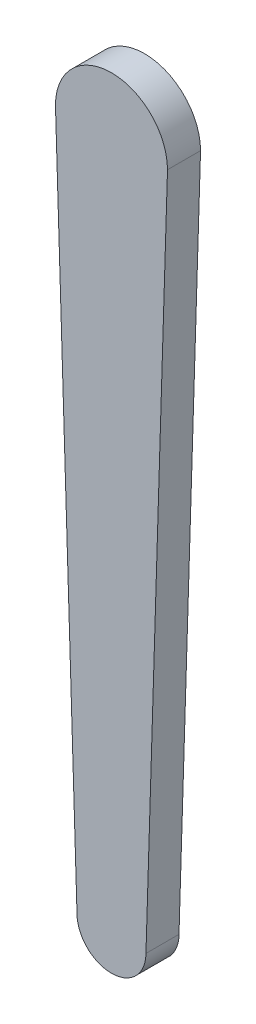
ISO-10303-21;
HEADER;
FILE_DESCRIPTION(('STEP AP214'),'2;1');
FILE_NAME('part.step','',(''),(''),'','','');
FILE_SCHEMA(('AUTOMOTIVE_DESIGN { 1 0 10303 214 1 1 1 1 }'));
ENDSEC;
DATA;
#1=APPLICATION_CONTEXT('core data for automotive mechanical design processes');
#2=APPLICATION_PROTOCOL_DEFINITION('international standard','automotive_design',2000,#1);
#3=PRODUCT_CONTEXT('',#1,'mechanical');
#4=PRODUCT('Part','Part','',(#3));
#5=PRODUCT_RELATED_PRODUCT_CATEGORY('part','',(#4));
#6=PRODUCT_DEFINITION_FORMATION('','',#4);
#7=PRODUCT_DEFINITION_CONTEXT('part definition',#1,'design');
#8=PRODUCT_DEFINITION('design','',#6,#7);
#9=PRODUCT_DEFINITION_SHAPE('','',#8);
#10=(LENGTH_UNIT() NAMED_UNIT(*) SI_UNIT(.MILLI.,.METRE.));
#11=(NAMED_UNIT(*) PLANE_ANGLE_UNIT() SI_UNIT($,.RADIAN.));
#12=(NAMED_UNIT(*) SI_UNIT($,.STERADIAN.) SOLID_ANGLE_UNIT());
#13=UNCERTAINTY_MEASURE_WITH_UNIT(LENGTH_MEASURE(1.E-05),#10,'distance_accuracy_value','');
#14=(GEOMETRIC_REPRESENTATION_CONTEXT(3) GLOBAL_UNCERTAINTY_ASSIGNED_CONTEXT((#13)) GLOBAL_UNIT_ASSIGNED_CONTEXT((#10,
#11,#12)) REPRESENTATION_CONTEXT('',''));
#15=CARTESIAN_POINT('',(0.,0.,0.));
#16=DIRECTION('',(0.,0.,1.));
#17=DIRECTION('',(1.,0.,0.));
#18=AXIS2_PLACEMENT_3D('',#15,#16,#17);
#19=CARTESIAN_POINT('',(15.7346341463415,-0.491707317073171,11.5));
#20=DIRECTION('',(0.999512076087079,-0.0312347523777212,0.));
#21=DIRECTION('',(0.0312347523777212,0.999512076087079,0.));
#22=AXIS2_PLACEMENT_3D('',#19,#20,#21);
#23=PLANE('',#22);
#24=DIRECTION('',(-0.0312347523777212,-0.999512076087079,0.));
#25=VECTOR('',#24,1.);
#26=CARTESIAN_POINT('',(15.7346341463415,-0.491707317073171,0.));
#27=LINE('',#26,#25);
#28=CARTESIAN_POINT('',(19.5,120.,0.));
#29=VERTEX_POINT('',#28);
#30=CARTESIAN_POINT('',(12.,-120.,0.));
#31=VERTEX_POINT('',#30);
#32=EDGE_CURVE('E101',#29,#31,#27,.T.);
#33=ORIENTED_EDGE('',*,*,#32,.F.);
#34=DIRECTION('',(0.,0.,-1.));
#35=VECTOR('',#34,1.);
#36=CARTESIAN_POINT('',(19.5,120.,11.5));
#37=LINE('',#36,#35);
#38=CARTESIAN_POINT('',(19.5,120.,11.5));
#39=VERTEX_POINT('',#38);
#40=EDGE_CURVE('E11',#39,#29,#37,.T.);
#41=ORIENTED_EDGE('',*,*,#40,.F.);
#42=DIRECTION('',(-0.0312347523777212,-0.999512076087079,0.));
#43=VECTOR('',#42,1.);
#44=CARTESIAN_POINT('',(15.7346341463415,-0.491707317073171,11.5));
#45=LINE('',#44,#43);
#46=CARTESIAN_POINT('',(12.,-120.,11.5));
#47=VERTEX_POINT('',#46);
#48=EDGE_CURVE('E89',#39,#47,#45,.T.);
#49=ORIENTED_EDGE('',*,*,#48,.T.);
#50=DIRECTION('',(0.,0.,-1.));
#51=VECTOR('',#50,1.);
#52=CARTESIAN_POINT('',(12.,-120.,11.5));
#53=LINE('',#52,#51);
#54=EDGE_CURVE('E78',#47,#31,#53,.T.);
#55=ORIENTED_EDGE('',*,*,#54,.T.);
#56=EDGE_LOOP('',(#33,#41,#49,#55));
#57=FACE_BOUND('',#56,.T.);
#58=ADVANCED_FACE('F39',(#57),#23,.T.);
#59=CARTESIAN_POINT('',(0.,120.,11.5));
#60=DIRECTION('',(0.,0.,-1.));
#61=DIRECTION('',(-1.,0.,0.));
#62=AXIS2_PLACEMENT_3D('',#59,#60,#61);
#63=CYLINDRICAL_SURFACE('',#62,19.5);
#64=CARTESIAN_POINT('',(0.,120.,0.));
#65=DIRECTION('',(0.,0.,1.));
#66=DIRECTION('',(1.,0.,0.));
#67=AXIS2_PLACEMENT_3D('',#64,#65,#66);
#68=CIRCLE('',#67,19.5);
#69=CARTESIAN_POINT('',(-19.5,120.,0.));
#70=VERTEX_POINT('',#69);
#71=EDGE_CURVE('E94',#29,#70,#68,.T.);
#72=ORIENTED_EDGE('',*,*,#71,.T.);
#73=DIRECTION('',(0.,0.,-1.));
#74=VECTOR('',#73,1.);
#75=CARTESIAN_POINT('',(-19.5,120.,11.5));
#76=LINE('',#75,#74);
#77=CARTESIAN_POINT('',(-19.5,120.,11.5));
#78=VERTEX_POINT('',#77);
#79=EDGE_CURVE('E47',#78,#70,#76,.T.);
#80=ORIENTED_EDGE('',*,*,#79,.F.);
#81=CARTESIAN_POINT('',(0.,120.,11.5));
#82=DIRECTION('',(0.,0.,1.));
#83=DIRECTION('',(1.,0.,0.));
#84=AXIS2_PLACEMENT_3D('',#81,#82,#83);
#85=CIRCLE('',#84,19.5);
#86=EDGE_CURVE('E84',#39,#78,#85,.T.);
#87=ORIENTED_EDGE('',*,*,#86,.F.);
#88=ORIENTED_EDGE('',*,*,#40,.T.);
#89=EDGE_LOOP('',(#72,#80,#87,#88));
#90=FACE_BOUND('',#89,.T.);
#91=ADVANCED_FACE('F92',(#90),#63,.T.);
#92=CARTESIAN_POINT('',(-15.7346341463415,-0.491707317073171,11.5));
#93=DIRECTION('',(0.999512076087079,0.0312347523777212,0.));
#94=DIRECTION('',(-0.0312347523777212,0.999512076087079,0.));
#95=AXIS2_PLACEMENT_3D('',#92,#93,#94);
#96=PLANE('',#95);
#97=DIRECTION('',(0.0312347523777212,-0.999512076087079,0.));
#98=VECTOR('',#97,1.);
#99=CARTESIAN_POINT('',(-15.7346341463415,-0.491707317073171,0.));
#100=LINE('',#99,#98);
#101=CARTESIAN_POINT('',(-12.,-120.,0.));
#102=VERTEX_POINT('',#101);
#103=EDGE_CURVE('E71',#70,#102,#100,.T.);
#104=ORIENTED_EDGE('',*,*,#103,.T.);
#105=DIRECTION('',(0.,0.,-1.));
#106=VECTOR('',#105,1.);
#107=CARTESIAN_POINT('',(-12.,-120.,11.5));
#108=LINE('',#107,#106);
#109=CARTESIAN_POINT('',(-12.,-120.,11.5));
#110=VERTEX_POINT('',#109);
#111=EDGE_CURVE('E95',#110,#102,#108,.T.);
#112=ORIENTED_EDGE('',*,*,#111,.F.);
#113=DIRECTION('',(0.0312347523777212,-0.999512076087079,0.));
#114=VECTOR('',#113,1.);
#115=CARTESIAN_POINT('',(-15.7346341463415,-0.491707317073171,11.5));
#116=LINE('',#115,#114);
#117=EDGE_CURVE('E88',#78,#110,#116,.T.);
#118=ORIENTED_EDGE('',*,*,#117,.F.);
#119=ORIENTED_EDGE('',*,*,#79,.T.);
#120=EDGE_LOOP('',(#104,#112,#118,#119));
#121=FACE_BOUND('',#120,.T.);
#122=ADVANCED_FACE('F96',(#121),#96,.F.);
#123=CARTESIAN_POINT('',(0.,-120.,11.5));
#124=DIRECTION('',(0.,0.,-1.));
#125=DIRECTION('',(-1.,0.,0.));
#126=AXIS2_PLACEMENT_3D('',#123,#124,#125);
#127=CYLINDRICAL_SURFACE('',#126,12.);
#128=CARTESIAN_POINT('',(0.,-120.,0.));
#129=DIRECTION('',(0.,0.,1.));
#130=DIRECTION('',(1.,0.,0.));
#131=AXIS2_PLACEMENT_3D('',#128,#129,#130);
#132=CIRCLE('',#131,12.);
#133=EDGE_CURVE('E106',#102,#31,#132,.T.);
#134=ORIENTED_EDGE('',*,*,#133,.T.);
#135=ORIENTED_EDGE('',*,*,#54,.F.);
#136=CARTESIAN_POINT('',(0.,-120.,11.5));
#137=DIRECTION('',(0.,0.,1.));
#138=DIRECTION('',(1.,0.,0.));
#139=AXIS2_PLACEMENT_3D('',#136,#137,#138);
#140=CIRCLE('',#139,12.);
#141=EDGE_CURVE('E55',#110,#47,#140,.T.);
#142=ORIENTED_EDGE('',*,*,#141,.F.);
#143=ORIENTED_EDGE('',*,*,#111,.T.);
#144=EDGE_LOOP('',(#134,#135,#142,#143));
#145=FACE_BOUND('',#144,.T.);
#146=ADVANCED_FACE('F111',(#145),#127,.T.);
#147=CARTESIAN_POINT('',(0.,0.,11.5));
#148=DIRECTION('',(0.,0.,1.));
#149=DIRECTION('',(1.,0.,0.));
#150=AXIS2_PLACEMENT_3D('',#147,#148,#149);
#151=PLANE('',#150);
#152=ORIENTED_EDGE('',*,*,#48,.F.);
#153=ORIENTED_EDGE('',*,*,#86,.T.);
#154=ORIENTED_EDGE('',*,*,#117,.T.);
#155=ORIENTED_EDGE('',*,*,#141,.T.);
#156=EDGE_LOOP('',(#152,#153,#154,#155));
#157=FACE_BOUND('',#156,.T.);
#158=ADVANCED_FACE('F86',(#157),#151,.T.);
#159=CARTESIAN_POINT('',(0.,0.,0.));
#160=DIRECTION('',(0.,0.,1.));
#161=DIRECTION('',(1.,0.,0.));
#162=AXIS2_PLACEMENT_3D('',#159,#160,#161);
#163=PLANE('',#162);
#164=ORIENTED_EDGE('',*,*,#32,.T.);
#165=ORIENTED_EDGE('',*,*,#133,.F.);
#166=ORIENTED_EDGE('',*,*,#103,.F.);
#167=ORIENTED_EDGE('',*,*,#71,.F.);
#168=EDGE_LOOP('',(#164,#165,#166,#167));
#169=FACE_BOUND('',#168,.T.);
#170=ADVANCED_FACE('F113',(#169),#163,.F.);
#171=CLOSED_SHELL('',(#58,#91,#122,#146,#158,#170));
#172=MANIFOLD_SOLID_BREP('B2',#171);
#173=ADVANCED_BREP_SHAPE_REPRESENTATION('',(#18,#172),#14);
#174=SHAPE_DEFINITION_REPRESENTATION(#9,#173);
ENDSEC;
END-ISO-10303-21;
